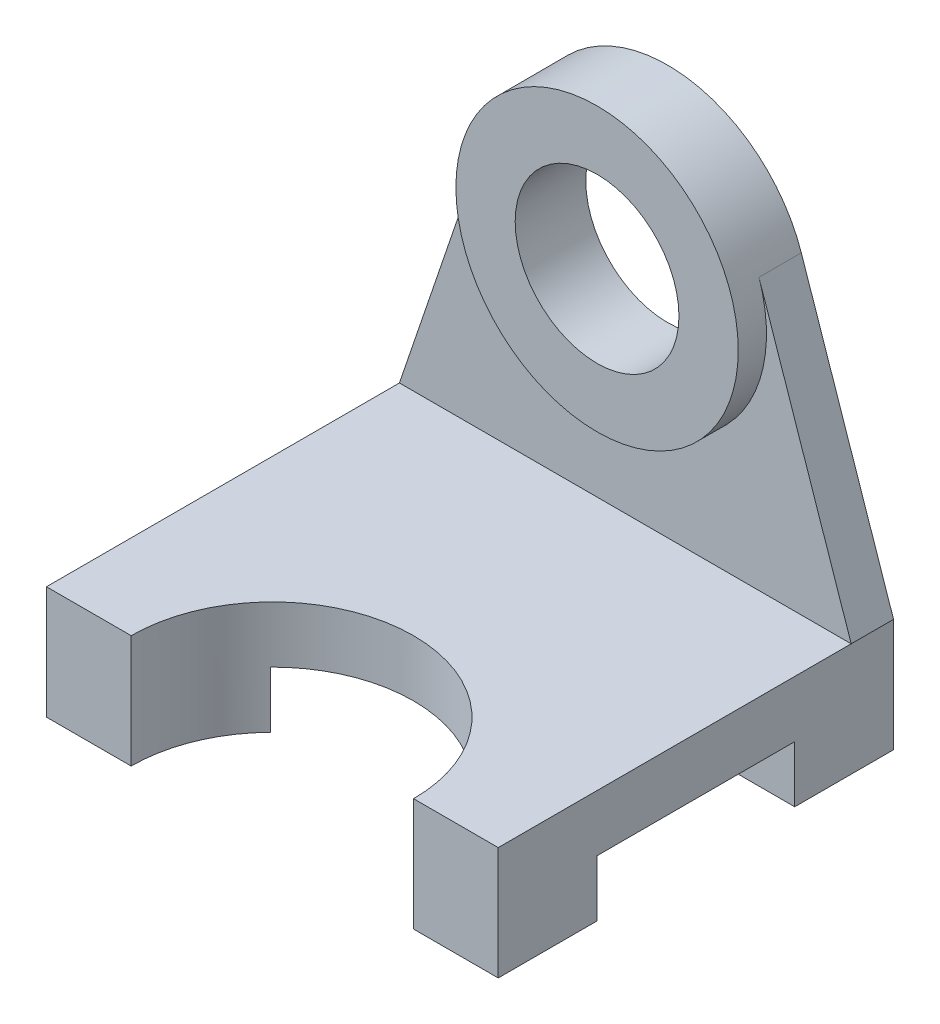
ISO-10303-21;
HEADER;
FILE_DESCRIPTION(('STEP AP214'),'2;1');
FILE_NAME('part.step','',(''),(''),'','','');
FILE_SCHEMA(('AUTOMOTIVE_DESIGN { 1 0 10303 214 1 1 1 1 }'));
ENDSEC;
DATA;
#1=APPLICATION_CONTEXT('core data for automotive mechanical design processes');
#2=APPLICATION_PROTOCOL_DEFINITION('international standard','automotive_design',2000,#1);
#3=PRODUCT_CONTEXT('',#1,'mechanical');
#4=PRODUCT('Part','Part','',(#3));
#5=PRODUCT_RELATED_PRODUCT_CATEGORY('part','',(#4));
#6=PRODUCT_DEFINITION_FORMATION('','',#4);
#7=PRODUCT_DEFINITION_CONTEXT('part definition',#1,'design');
#8=PRODUCT_DEFINITION('design','',#6,#7);
#9=PRODUCT_DEFINITION_SHAPE('','',#8);
#10=(LENGTH_UNIT() NAMED_UNIT(*) SI_UNIT(.MILLI.,.METRE.));
#11=(NAMED_UNIT(*) PLANE_ANGLE_UNIT() SI_UNIT($,.RADIAN.));
#12=(NAMED_UNIT(*) SI_UNIT($,.STERADIAN.) SOLID_ANGLE_UNIT());
#13=UNCERTAINTY_MEASURE_WITH_UNIT(LENGTH_MEASURE(1.E-05),#10,'distance_accuracy_value','');
#14=(GEOMETRIC_REPRESENTATION_CONTEXT(3) GLOBAL_UNCERTAINTY_ASSIGNED_CONTEXT((#13)) GLOBAL_UNIT_ASSIGNED_CONTEXT((#10,
#11,#12)) REPRESENTATION_CONTEXT('',''));
#15=CARTESIAN_POINT('',(0.,0.,0.));
#16=DIRECTION('',(0.,0.,1.));
#17=DIRECTION('',(1.,0.,0.));
#18=AXIS2_PLACEMENT_3D('',#15,#16,#17);
#19=CARTESIAN_POINT('',(160.,40.,0.));
#20=DIRECTION('',(1.,0.,0.));
#21=DIRECTION('',(0.,0.,-1.));
#22=AXIS2_PLACEMENT_3D('',#19,#20,#21);
#23=PLANE('',#22);
#24=DIRECTION('',(0.,0.,-1.));
#25=VECTOR('',#24,1.);
#26=CARTESIAN_POINT('',(160.,20.,0.));
#27=LINE('',#26,#25);
#28=CARTESIAN_POINT('',(160.,20.,105.));
#29=VERTEX_POINT('',#28);
#30=CARTESIAN_POINT('',(160.,20.,35.));
#31=VERTEX_POINT('',#30);
#32=EDGE_CURVE('E191',#29,#31,#27,.T.);
#33=ORIENTED_EDGE('',*,*,#32,.T.);
#34=DIRECTION('',(0.,1.,0.));
#35=VECTOR('',#34,1.);
#36=CARTESIAN_POINT('',(160.,0.,35.));
#37=LINE('',#36,#35);
#38=CARTESIAN_POINT('',(160.,0.,35.));
#39=VERTEX_POINT('',#38);
#40=EDGE_CURVE('E172',#39,#31,#37,.T.);
#41=ORIENTED_EDGE('',*,*,#40,.F.);
#42=DIRECTION('',(0.,0.,1.));
#43=VECTOR('',#42,1.);
#44=CARTESIAN_POINT('',(160.,0.,0.));
#45=LINE('',#44,#43);
#46=CARTESIAN_POINT('',(160.,0.,0.));
#47=VERTEX_POINT('',#46);
#48=EDGE_CURVE('E239',#47,#39,#45,.T.);
#49=ORIENTED_EDGE('',*,*,#48,.F.);
#50=DIRECTION('',(0.,-1.,0.));
#51=VECTOR('',#50,1.);
#52=CARTESIAN_POINT('',(160.,40.,0.));
#53=LINE('',#52,#51);
#54=CARTESIAN_POINT('',(160.,40.,0.));
#55=VERTEX_POINT('',#54);
#56=EDGE_CURVE('E256',#55,#47,#53,.T.);
#57=ORIENTED_EDGE('',*,*,#56,.F.);
#58=DIRECTION('',(0.,0.,1.));
#59=VECTOR('',#58,1.);
#60=CARTESIAN_POINT('',(160.,40.,0.));
#61=LINE('',#60,#59);
#62=CARTESIAN_POINT('',(160.,40.,15.));
#63=VERTEX_POINT('',#62);
#64=EDGE_CURVE('E227',#55,#63,#61,.T.);
#65=ORIENTED_EDGE('',*,*,#64,.T.);
#66=CARTESIAN_POINT('',(160.,40.,140.));
#67=VERTEX_POINT('',#66);
#68=EDGE_CURVE('E225',#63,#67,#61,.T.);
#69=ORIENTED_EDGE('',*,*,#68,.T.);
#70=DIRECTION('',(0.,-1.,0.));
#71=VECTOR('',#70,1.);
#72=CARTESIAN_POINT('',(160.,40.,140.));
#73=LINE('',#72,#71);
#74=CARTESIAN_POINT('',(160.,0.,140.));
#75=VERTEX_POINT('',#74);
#76=EDGE_CURVE('E258',#67,#75,#73,.T.);
#77=ORIENTED_EDGE('',*,*,#76,.T.);
#78=CARTESIAN_POINT('',(160.,0.,105.));
#79=VERTEX_POINT('',#78);
#80=EDGE_CURVE('E238',#79,#75,#45,.T.);
#81=ORIENTED_EDGE('',*,*,#80,.F.);
#82=DIRECTION('',(0.,1.,0.));
#83=VECTOR('',#82,1.);
#84=CARTESIAN_POINT('',(160.,0.,105.));
#85=LINE('',#84,#83);
#86=EDGE_CURVE('E66',#79,#29,#85,.T.);
#87=ORIENTED_EDGE('',*,*,#86,.T.);
#88=EDGE_LOOP('',(#33,#41,#49,#57,#65,#69,#77,#81,#87));
#89=FACE_BOUND('',#88,.T.);
#90=ADVANCED_FACE('F43',(#89),#23,.T.);
#91=CARTESIAN_POINT('',(0.,40.,0.));
#92=DIRECTION('',(1.,0.,0.));
#93=DIRECTION('',(0.,0.,-1.));
#94=AXIS2_PLACEMENT_3D('',#91,#92,#93);
#95=PLANE('',#94);
#96=DIRECTION('',(0.,-1.,0.));
#97=VECTOR('',#96,1.);
#98=CARTESIAN_POINT('',(0.,40.,35.));
#99=LINE('',#98,#97);
#100=CARTESIAN_POINT('',(0.,20.,35.));
#101=VERTEX_POINT('',#100);
#102=CARTESIAN_POINT('',(0.,0.,35.));
#103=VERTEX_POINT('',#102);
#104=EDGE_CURVE('E213',#101,#103,#99,.T.);
#105=ORIENTED_EDGE('',*,*,#104,.F.);
#106=DIRECTION('',(0.,0.,1.));
#107=VECTOR('',#106,1.);
#108=CARTESIAN_POINT('',(0.,20.,0.));
#109=LINE('',#108,#107);
#110=CARTESIAN_POINT('',(0.,20.,105.));
#111=VERTEX_POINT('',#110);
#112=EDGE_CURVE('E11',#101,#111,#109,.T.);
#113=ORIENTED_EDGE('',*,*,#112,.T.);
#114=DIRECTION('',(0.,-1.,0.));
#115=VECTOR('',#114,1.);
#116=CARTESIAN_POINT('',(0.,40.,105.));
#117=LINE('',#116,#115);
#118=CARTESIAN_POINT('',(0.,0.,105.));
#119=VERTEX_POINT('',#118);
#120=EDGE_CURVE('E198',#111,#119,#117,.T.);
#121=ORIENTED_EDGE('',*,*,#120,.T.);
#122=DIRECTION('',(0.,0.,1.));
#123=VECTOR('',#122,1.);
#124=CARTESIAN_POINT('',(0.,0.,0.));
#125=LINE('',#124,#123);
#126=CARTESIAN_POINT('',(0.,0.,140.));
#127=VERTEX_POINT('',#126);
#128=EDGE_CURVE('E245',#119,#127,#125,.T.);
#129=ORIENTED_EDGE('',*,*,#128,.T.);
#130=DIRECTION('',(0.,-1.,0.));
#131=VECTOR('',#130,1.);
#132=CARTESIAN_POINT('',(0.,40.,140.));
#133=LINE('',#132,#131);
#134=CARTESIAN_POINT('',(0.,40.,140.));
#135=VERTEX_POINT('',#134);
#136=EDGE_CURVE('E252',#135,#127,#133,.T.);
#137=ORIENTED_EDGE('',*,*,#136,.F.);
#138=DIRECTION('',(0.,0.,1.));
#139=VECTOR('',#138,1.);
#140=CARTESIAN_POINT('',(0.,40.,0.));
#141=LINE('',#140,#139);
#142=CARTESIAN_POINT('',(0.,40.,15.));
#143=VERTEX_POINT('',#142);
#144=EDGE_CURVE('E229',#143,#135,#141,.T.);
#145=ORIENTED_EDGE('',*,*,#144,.F.);
#146=CARTESIAN_POINT('',(0.,40.,0.));
#147=VERTEX_POINT('',#146);
#148=EDGE_CURVE('E230',#147,#143,#141,.T.);
#149=ORIENTED_EDGE('',*,*,#148,.F.);
#150=DIRECTION('',(0.,-1.,0.));
#151=VECTOR('',#150,1.);
#152=CARTESIAN_POINT('',(0.,40.,0.));
#153=LINE('',#152,#151);
#154=CARTESIAN_POINT('',(0.,0.,0.));
#155=VERTEX_POINT('',#154);
#156=EDGE_CURVE('E177',#147,#155,#153,.T.);
#157=ORIENTED_EDGE('',*,*,#156,.T.);
#158=EDGE_CURVE('E246',#155,#103,#125,.T.);
#159=ORIENTED_EDGE('',*,*,#158,.T.);
#160=EDGE_LOOP('',(#105,#113,#121,#129,#137,#145,#149,#157,#159));
#161=FACE_BOUND('',#160,.T.);
#162=ADVANCED_FACE('F281',(#161),#95,.F.);
#163=CARTESIAN_POINT('',(0.,0.,0.));
#164=DIRECTION('',(0.,1.,0.));
#165=DIRECTION('',(0.,0.,1.));
#166=AXIS2_PLACEMENT_3D('',#163,#164,#165);
#167=PLANE('',#166);
#168=DIRECTION('',(-1.,0.,0.));
#169=VECTOR('',#168,1.);
#170=CARTESIAN_POINT('',(160.,0.,35.));
#171=LINE('',#170,#169);
#172=EDGE_CURVE('E194',#39,#103,#171,.T.);
#173=ORIENTED_EDGE('',*,*,#172,.T.);
#174=ORIENTED_EDGE('',*,*,#158,.F.);
#175=DIRECTION('',(1.,0.,0.));
#176=VECTOR('',#175,1.);
#177=CARTESIAN_POINT('',(0.,0.,0.));
#178=LINE('',#177,#176);
#179=EDGE_CURVE('E242',#155,#47,#178,.T.);
#180=ORIENTED_EDGE('',*,*,#179,.T.);
#181=ORIENTED_EDGE('',*,*,#48,.T.);
#182=EDGE_LOOP('',(#173,#174,#180,#181));
#183=FACE_BOUND('',#182,.T.);
#184=ADVANCED_FACE('F308',(#183),#167,.F.);
#185=ORIENTED_EDGE('',*,*,#128,.F.);
#186=DIRECTION('',(1.,0.,0.));
#187=VECTOR('',#186,1.);
#188=CARTESIAN_POINT('',(0.,0.,105.));
#189=LINE('',#188,#187);
#190=CARTESIAN_POINT('',(44.2928578572858,0.,105.));
#191=VERTEX_POINT('',#190);
#192=EDGE_CURVE('E51',#119,#191,#189,.T.);
#193=ORIENTED_EDGE('',*,*,#192,.T.);
#194=CARTESIAN_POINT('',(80.,0.,140.));
#195=DIRECTION('',(0.,1.,0.));
#196=DIRECTION('',(0.,0.,1.));
#197=AXIS2_PLACEMENT_3D('',#194,#195,#196);
#198=CIRCLE('',#197,50.);
#199=CARTESIAN_POINT('',(30.,0.,140.));
#200=VERTEX_POINT('',#199);
#201=EDGE_CURVE('E217',#191,#200,#198,.T.);
#202=ORIENTED_EDGE('',*,*,#201,.T.);
#203=DIRECTION('',(1.,0.,0.));
#204=VECTOR('',#203,1.);
#205=CARTESIAN_POINT('',(0.,0.,140.));
#206=LINE('',#205,#204);
#207=EDGE_CURVE('E222',#127,#200,#206,.T.);
#208=ORIENTED_EDGE('',*,*,#207,.F.);
#209=EDGE_LOOP('',(#185,#193,#202,#208));
#210=FACE_BOUND('',#209,.T.);
#211=ADVANCED_FACE('F266',(#210),#167,.F.);
#212=CARTESIAN_POINT('',(80.,40.,140.));
#213=DIRECTION('',(0.,-1.,0.));
#214=DIRECTION('',(0.,0.,-1.));
#215=AXIS2_PLACEMENT_3D('',#212,#213,#214);
#216=CYLINDRICAL_SURFACE('',#215,50.);
#217=DIRECTION('',(0.,-1.,0.));
#218=VECTOR('',#217,1.);
#219=CARTESIAN_POINT('',(44.2928578572858,40.,105.));
#220=LINE('',#219,#218);
#221=CARTESIAN_POINT('',(44.2928578572858,20.,105.));
#222=VERTEX_POINT('',#221);
#223=EDGE_CURVE('E211',#222,#191,#220,.T.);
#224=ORIENTED_EDGE('',*,*,#223,.F.);
#225=CARTESIAN_POINT('',(80.,20.,140.));
#226=DIRECTION('',(0.,1.,0.));
#227=DIRECTION('',(0.,0.,1.));
#228=AXIS2_PLACEMENT_3D('',#225,#226,#227);
#229=CIRCLE('',#228,50.);
#230=CARTESIAN_POINT('',(115.707142142714,20.,105.));
#231=VERTEX_POINT('',#230);
#232=EDGE_CURVE('E215',#231,#222,#229,.T.);
#233=ORIENTED_EDGE('',*,*,#232,.F.);
#234=DIRECTION('',(0.,-1.,0.));
#235=VECTOR('',#234,1.);
#236=CARTESIAN_POINT('',(115.707142142714,40.,105.));
#237=LINE('',#236,#235);
#238=CARTESIAN_POINT('',(115.707142142714,0.,105.));
#239=VERTEX_POINT('',#238);
#240=EDGE_CURVE('E209',#239,#231,#237,.F.);
#241=ORIENTED_EDGE('',*,*,#240,.F.);
#242=CARTESIAN_POINT('',(130.,0.,140.));
#243=VERTEX_POINT('',#242);
#244=EDGE_CURVE('E232',#243,#239,#198,.T.);
#245=ORIENTED_EDGE('',*,*,#244,.F.);
#246=DIRECTION('',(0.,-1.,0.));
#247=VECTOR('',#246,1.);
#248=CARTESIAN_POINT('',(130.,40.,140.));
#249=LINE('',#248,#247);
#250=CARTESIAN_POINT('',(130.,40.,140.));
#251=VERTEX_POINT('',#250);
#252=EDGE_CURVE('E261',#251,#243,#249,.T.);
#253=ORIENTED_EDGE('',*,*,#252,.F.);
#254=CARTESIAN_POINT('',(80.,40.,140.));
#255=DIRECTION('',(0.,1.,0.));
#256=DIRECTION('',(0.,0.,1.));
#257=AXIS2_PLACEMENT_3D('',#254,#255,#256);
#258=CIRCLE('',#257,50.);
#259=CARTESIAN_POINT('',(30.,40.,140.));
#260=VERTEX_POINT('',#259);
#261=EDGE_CURVE('E218',#251,#260,#258,.T.);
#262=ORIENTED_EDGE('',*,*,#261,.T.);
#263=DIRECTION('',(0.,-1.,0.));
#264=VECTOR('',#263,1.);
#265=CARTESIAN_POINT('',(30.,40.,140.));
#266=LINE('',#265,#264);
#267=EDGE_CURVE('E249',#260,#200,#266,.T.);
#268=ORIENTED_EDGE('',*,*,#267,.T.);
#269=ORIENTED_EDGE('',*,*,#201,.F.);
#270=EDGE_LOOP('',(#224,#233,#241,#245,#253,#262,#268,#269));
#271=FACE_BOUND('',#270,.T.);
#272=ADVANCED_FACE('F45',(#271),#216,.F.);
#273=CARTESIAN_POINT('',(0.,40.,140.));
#274=DIRECTION('',(0.,0.,-1.));
#275=DIRECTION('',(-1.,0.,0.));
#276=AXIS2_PLACEMENT_3D('',#273,#274,#275);
#277=PLANE('',#276);
#278=EDGE_CURVE('E235',#243,#75,#206,.T.);
#279=ORIENTED_EDGE('',*,*,#278,.T.);
#280=ORIENTED_EDGE('',*,*,#76,.F.);
#281=DIRECTION('',(1.,0.,0.));
#282=VECTOR('',#281,1.);
#283=CARTESIAN_POINT('',(0.,40.,140.));
#284=LINE('',#283,#282);
#285=EDGE_CURVE('E221',#251,#67,#284,.T.);
#286=ORIENTED_EDGE('',*,*,#285,.F.);
#287=ORIENTED_EDGE('',*,*,#252,.T.);
#288=EDGE_LOOP('',(#279,#280,#286,#287));
#289=FACE_BOUND('',#288,.T.);
#290=ADVANCED_FACE('F297',(#289),#277,.F.);
#291=CARTESIAN_POINT('',(0.,40.,0.));
#292=DIRECTION('',(0.,0.,-1.));
#293=DIRECTION('',(-1.,0.,0.));
#294=AXIS2_PLACEMENT_3D('',#291,#292,#293);
#295=PLANE('',#294);
#296=ORIENTED_EDGE('',*,*,#179,.F.);
#297=ORIENTED_EDGE('',*,*,#156,.F.);
#298=DIRECTION('',(0.321805722818264,0.946805722818264,0.));
#299=VECTOR('',#298,1.);
#300=CARTESIAN_POINT('',(-12.1875,4.14235692954342,0.));
#301=LINE('',#300,#299);
#302=CARTESIAN_POINT('',(32.6597138590869,136.090286140913,0.));
#303=VERTEX_POINT('',#302);
#304=EDGE_CURVE('E169',#147,#303,#301,.T.);
#305=ORIENTED_EDGE('',*,*,#304,.T.);
#306=CARTESIAN_POINT('',(80.,120.,0.));
#307=DIRECTION('',(0.,0.,-1.));
#308=DIRECTION('',(-1.,0.,0.));
#309=AXIS2_PLACEMENT_3D('',#306,#307,#308);
#310=CIRCLE('',#309,50.);
#311=CARTESIAN_POINT('',(127.340286140913,136.090286140913,0.));
#312=VERTEX_POINT('',#311);
#313=EDGE_CURVE('E150',#303,#312,#310,.T.);
#314=ORIENTED_EDGE('',*,*,#313,.T.);
#315=DIRECTION('',(-0.321805722818264,0.946805722818264,0.));
#316=VECTOR('',#315,1.);
#317=CARTESIAN_POINT('',(155.618072281826,52.8923569295435,0.));
#318=LINE('',#317,#316);
#319=EDGE_CURVE('E180',#55,#312,#318,.T.);
#320=ORIENTED_EDGE('',*,*,#319,.F.);
#321=ORIENTED_EDGE('',*,*,#56,.T.);
#322=EDGE_LOOP('',(#296,#297,#305,#314,#320,#321));
#323=FACE_BOUND('',#322,.T.);
#324=CARTESIAN_POINT('',(80.,120.,0.));
#325=DIRECTION('',(0.,0.,-1.));
#326=DIRECTION('',(-1.,0.,0.));
#327=AXIS2_PLACEMENT_3D('',#324,#325,#326);
#328=CIRCLE('',#327,29.);
#329=CARTESIAN_POINT('',(51.,120.,0.));
#330=VERTEX_POINT('',#329);
#331=EDGE_CURVE('E162',#330,#330,#328,.T.);
#332=ORIENTED_EDGE('',*,*,#331,.F.);
#333=EDGE_LOOP('',(#332));
#334=FACE_BOUND('',#333,.T.);
#335=ADVANCED_FACE('F175',(#323,#334),#295,.T.);
#336=ORIENTED_EDGE('',*,*,#207,.T.);
#337=ORIENTED_EDGE('',*,*,#267,.F.);
#338=EDGE_CURVE('E226',#135,#260,#284,.T.);
#339=ORIENTED_EDGE('',*,*,#338,.F.);
#340=ORIENTED_EDGE('',*,*,#136,.T.);
#341=EDGE_LOOP('',(#336,#337,#339,#340));
#342=FACE_BOUND('',#341,.T.);
#343=ADVANCED_FACE('F277',(#342),#277,.F.);
#344=CARTESIAN_POINT('',(0.,40.,0.));
#345=DIRECTION('',(0.,1.,0.));
#346=DIRECTION('',(0.,0.,1.));
#347=AXIS2_PLACEMENT_3D('',#344,#345,#346);
#348=PLANE('',#347);
#349=DIRECTION('',(1.,0.,0.));
#350=VECTOR('',#349,1.);
#351=CARTESIAN_POINT('',(0.,40.,15.));
#352=LINE('',#351,#350);
#353=EDGE_CURVE('E58',#143,#63,#352,.T.);
#354=ORIENTED_EDGE('',*,*,#353,.F.);
#355=ORIENTED_EDGE('',*,*,#144,.T.);
#356=ORIENTED_EDGE('',*,*,#338,.T.);
#357=ORIENTED_EDGE('',*,*,#261,.F.);
#358=ORIENTED_EDGE('',*,*,#285,.T.);
#359=ORIENTED_EDGE('',*,*,#68,.F.);
#360=EDGE_LOOP('',(#354,#355,#356,#357,#358,#359));
#361=FACE_BOUND('',#360,.T.);
#362=ADVANCED_FACE('F299',(#361),#348,.T.);
#363=ORIENTED_EDGE('',*,*,#244,.T.);
#364=DIRECTION('',(-1.,0.,0.));
#365=VECTOR('',#364,1.);
#366=CARTESIAN_POINT('',(160.,0.,105.));
#367=LINE('',#366,#365);
#368=EDGE_CURVE('E203',#79,#239,#367,.T.);
#369=ORIENTED_EDGE('',*,*,#368,.F.);
#370=ORIENTED_EDGE('',*,*,#80,.T.);
#371=ORIENTED_EDGE('',*,*,#278,.F.);
#372=EDGE_LOOP('',(#363,#369,#370,#371));
#373=FACE_BOUND('',#372,.T.);
#374=ADVANCED_FACE('F293',(#373),#167,.F.);
#375=CARTESIAN_POINT('',(160.,20.,0.));
#376=DIRECTION('',(0.,1.,0.));
#377=DIRECTION('',(0.,0.,1.));
#378=AXIS2_PLACEMENT_3D('',#375,#376,#377);
#379=PLANE('',#378);
#380=ORIENTED_EDGE('',*,*,#232,.T.);
#381=DIRECTION('',(-1.,0.,0.));
#382=VECTOR('',#381,1.);
#383=CARTESIAN_POINT('',(160.,20.,105.));
#384=LINE('',#383,#382);
#385=EDGE_CURVE('E202',#222,#111,#384,.T.);
#386=ORIENTED_EDGE('',*,*,#385,.T.);
#387=ORIENTED_EDGE('',*,*,#112,.F.);
#388=DIRECTION('',(-1.,0.,0.));
#389=VECTOR('',#388,1.);
#390=CARTESIAN_POINT('',(160.,20.,35.));
#391=LINE('',#390,#389);
#392=EDGE_CURVE('E195',#31,#101,#391,.T.);
#393=ORIENTED_EDGE('',*,*,#392,.F.);
#394=ORIENTED_EDGE('',*,*,#32,.F.);
#395=EDGE_CURVE('E199',#29,#231,#384,.T.);
#396=ORIENTED_EDGE('',*,*,#395,.T.);
#397=EDGE_LOOP('',(#380,#386,#387,#393,#394,#396));
#398=FACE_BOUND('',#397,.T.);
#399=ADVANCED_FACE('F286',(#398),#379,.F.);
#400=CARTESIAN_POINT('',(160.,0.,35.));
#401=DIRECTION('',(0.,0.,1.));
#402=DIRECTION('',(1.,0.,0.));
#403=AXIS2_PLACEMENT_3D('',#400,#401,#402);
#404=PLANE('',#403);
#405=ORIENTED_EDGE('',*,*,#104,.T.);
#406=ORIENTED_EDGE('',*,*,#172,.F.);
#407=ORIENTED_EDGE('',*,*,#40,.T.);
#408=ORIENTED_EDGE('',*,*,#392,.T.);
#409=EDGE_LOOP('',(#405,#406,#407,#408));
#410=FACE_BOUND('',#409,.T.);
#411=ADVANCED_FACE('F379',(#410),#404,.T.);
#412=CARTESIAN_POINT('',(160.,0.,105.));
#413=DIRECTION('',(0.,0.,1.));
#414=DIRECTION('',(1.,0.,0.));
#415=AXIS2_PLACEMENT_3D('',#412,#413,#414);
#416=PLANE('',#415);
#417=ORIENTED_EDGE('',*,*,#223,.T.);
#418=ORIENTED_EDGE('',*,*,#192,.F.);
#419=ORIENTED_EDGE('',*,*,#120,.F.);
#420=ORIENTED_EDGE('',*,*,#385,.F.);
#421=EDGE_LOOP('',(#417,#418,#419,#420));
#422=FACE_BOUND('',#421,.T.);
#423=ADVANCED_FACE('F284',(#422),#416,.F.);
#424=ORIENTED_EDGE('',*,*,#240,.T.);
#425=ORIENTED_EDGE('',*,*,#395,.F.);
#426=ORIENTED_EDGE('',*,*,#86,.F.);
#427=ORIENTED_EDGE('',*,*,#368,.T.);
#428=EDGE_LOOP('',(#424,#425,#426,#427));
#429=FACE_BOUND('',#428,.T.);
#430=ADVANCED_FACE('F373',(#429),#416,.F.);
#431=CARTESIAN_POINT('',(-12.1875,4.14235692954342,15.));
#432=DIRECTION('',(-0.946805722818264,0.321805722818264,0.));
#433=DIRECTION('',(-0.321805722818264,-0.946805722818264,0.));
#434=AXIS2_PLACEMENT_3D('',#431,#432,#433);
#435=PLANE('',#434);
#436=ORIENTED_EDGE('',*,*,#304,.F.);
#437=ORIENTED_EDGE('',*,*,#148,.T.);
#438=DIRECTION('',(0.321805722818264,0.946805722818264,0.));
#439=VECTOR('',#438,1.);
#440=CARTESIAN_POINT('',(-12.1875,4.14235692954342,15.));
#441=LINE('',#440,#439);
#442=CARTESIAN_POINT('',(32.6597138590869,136.090286140913,15.));
#443=VERTEX_POINT('',#442);
#444=EDGE_CURVE('E171',#143,#443,#441,.T.);
#445=ORIENTED_EDGE('',*,*,#444,.T.);
#446=DIRECTION('',(0.,0.,-1.));
#447=VECTOR('',#446,1.);
#448=CARTESIAN_POINT('',(32.6597138590869,136.090286140913,15.));
#449=LINE('',#448,#447);
#450=EDGE_CURVE('E153',#443,#303,#449,.T.);
#451=ORIENTED_EDGE('',*,*,#450,.T.);
#452=EDGE_LOOP('',(#436,#437,#445,#451));
#453=FACE_BOUND('',#452,.T.);
#454=ADVANCED_FACE('F167',(#453),#435,.T.);
#455=CARTESIAN_POINT('',(155.618072281826,52.8923569295435,15.));
#456=DIRECTION('',(-0.946805722818264,-0.321805722818264,0.));
#457=DIRECTION('',(0.321805722818264,-0.946805722818264,0.));
#458=AXIS2_PLACEMENT_3D('',#455,#456,#457);
#459=PLANE('',#458);
#460=ORIENTED_EDGE('',*,*,#319,.T.);
#461=DIRECTION('',(0.,0.,-1.));
#462=VECTOR('',#461,1.);
#463=CARTESIAN_POINT('',(127.340286140913,136.090286140913,15.));
#464=LINE('',#463,#462);
#465=CARTESIAN_POINT('',(127.340286140913,136.090286140913,15.));
#466=VERTEX_POINT('',#465);
#467=EDGE_CURVE('E156',#466,#312,#464,.T.);
#468=ORIENTED_EDGE('',*,*,#467,.F.);
#469=DIRECTION('',(-0.321805722818264,0.946805722818264,0.));
#470=VECTOR('',#469,1.);
#471=CARTESIAN_POINT('',(155.618072281826,52.8923569295435,15.));
#472=LINE('',#471,#470);
#473=EDGE_CURVE('E182',#63,#466,#472,.T.);
#474=ORIENTED_EDGE('',*,*,#473,.F.);
#475=ORIENTED_EDGE('',*,*,#64,.F.);
#476=EDGE_LOOP('',(#460,#468,#474,#475));
#477=FACE_BOUND('',#476,.T.);
#478=ADVANCED_FACE('F371',(#477),#459,.F.);
#479=CARTESIAN_POINT('',(0.,0.,15.));
#480=DIRECTION('',(0.,0.,-1.));
#481=DIRECTION('',(-1.,0.,0.));
#482=AXIS2_PLACEMENT_3D('',#479,#480,#481);
#483=PLANE('',#482);
#484=CARTESIAN_POINT('',(80.,120.,15.));
#485=DIRECTION('',(0.,0.,-1.));
#486=DIRECTION('',(-1.,0.,0.));
#487=AXIS2_PLACEMENT_3D('',#484,#485,#486);
#488=CIRCLE('',#487,50.);
#489=EDGE_CURVE('E179',#466,#443,#488,.T.);
#490=ORIENTED_EDGE('',*,*,#489,.T.);
#491=ORIENTED_EDGE('',*,*,#444,.F.);
#492=ORIENTED_EDGE('',*,*,#353,.T.);
#493=ORIENTED_EDGE('',*,*,#473,.T.);
#494=EDGE_LOOP('',(#490,#491,#492,#493));
#495=FACE_BOUND('',#494,.T.);
#496=ADVANCED_FACE('F340',(#495),#483,.F.);
#497=CARTESIAN_POINT('',(80.,120.,25.));
#498=DIRECTION('',(0.,0.,-1.));
#499=DIRECTION('',(-1.,0.,0.));
#500=AXIS2_PLACEMENT_3D('',#497,#498,#499);
#501=CYLINDRICAL_SURFACE('',#500,50.);
#502=CARTESIAN_POINT('',(80.,120.,25.));
#503=DIRECTION('',(0.,0.,-1.));
#504=DIRECTION('',(-1.,0.,0.));
#505=AXIS2_PLACEMENT_3D('',#502,#503,#504);
#506=CIRCLE('',#505,50.);
#507=CARTESIAN_POINT('',(30.,120.,25.));
#508=VERTEX_POINT('',#507);
#509=EDGE_CURVE('E184',#508,#508,#506,.T.);
#510=ORIENTED_EDGE('',*,*,#509,.T.);
#511=EDGE_LOOP('',(#510));
#512=FACE_BOUND('',#511,.T.);
#513=ORIENTED_EDGE('',*,*,#450,.F.);
#514=ORIENTED_EDGE('',*,*,#489,.F.);
#515=ORIENTED_EDGE('',*,*,#467,.T.);
#516=ORIENTED_EDGE('',*,*,#313,.F.);
#517=EDGE_LOOP('',(#513,#514,#515,#516));
#518=FACE_BOUND('',#517,.T.);
#519=ADVANCED_FACE('F152',(#512,#518),#501,.T.);
#520=CARTESIAN_POINT('',(80.,120.,25.));
#521=DIRECTION('',(0.,0.,-1.));
#522=DIRECTION('',(-1.,0.,0.));
#523=AXIS2_PLACEMENT_3D('',#520,#521,#522);
#524=CYLINDRICAL_SURFACE('',#523,29.);
#525=CARTESIAN_POINT('',(80.,120.,25.));
#526=DIRECTION('',(0.,0.,-1.));
#527=DIRECTION('',(-1.,0.,0.));
#528=AXIS2_PLACEMENT_3D('',#525,#526,#527);
#529=CIRCLE('',#528,29.);
#530=CARTESIAN_POINT('',(51.,120.,25.));
#531=VERTEX_POINT('',#530);
#532=EDGE_CURVE('E161',#531,#531,#529,.T.);
#533=ORIENTED_EDGE('',*,*,#532,.F.);
#534=EDGE_LOOP('',(#533));
#535=FACE_BOUND('',#534,.T.);
#536=ORIENTED_EDGE('',*,*,#331,.T.);
#537=EDGE_LOOP('',(#536));
#538=FACE_BOUND('',#537,.T.);
#539=ADVANCED_FACE('F356',(#535,#538),#524,.F.);
#540=CARTESIAN_POINT('',(0.,0.,25.));
#541=DIRECTION('',(0.,0.,-1.));
#542=DIRECTION('',(-1.,0.,0.));
#543=AXIS2_PLACEMENT_3D('',#540,#541,#542);
#544=PLANE('',#543);
#545=ORIENTED_EDGE('',*,*,#532,.T.);
#546=EDGE_LOOP('',(#545));
#547=FACE_BOUND('',#546,.T.);
#548=ORIENTED_EDGE('',*,*,#509,.F.);
#549=EDGE_LOOP('',(#548));
#550=FACE_BOUND('',#549,.T.);
#551=ADVANCED_FACE('F353',(#547,#550),#544,.F.);
#552=CLOSED_SHELL('',(#90,#162,#184,#211,#272,#290,#335,#343,#362,#374,#399,#411,#423,#430,#454,
#478,#496,#519,#539,#551));
#553=MANIFOLD_SOLID_BREP('B2',#552);
#554=ADVANCED_BREP_SHAPE_REPRESENTATION('',(#18,#553),#14);
#555=SHAPE_DEFINITION_REPRESENTATION(#9,#554);
ENDSEC;
END-ISO-10303-21;
